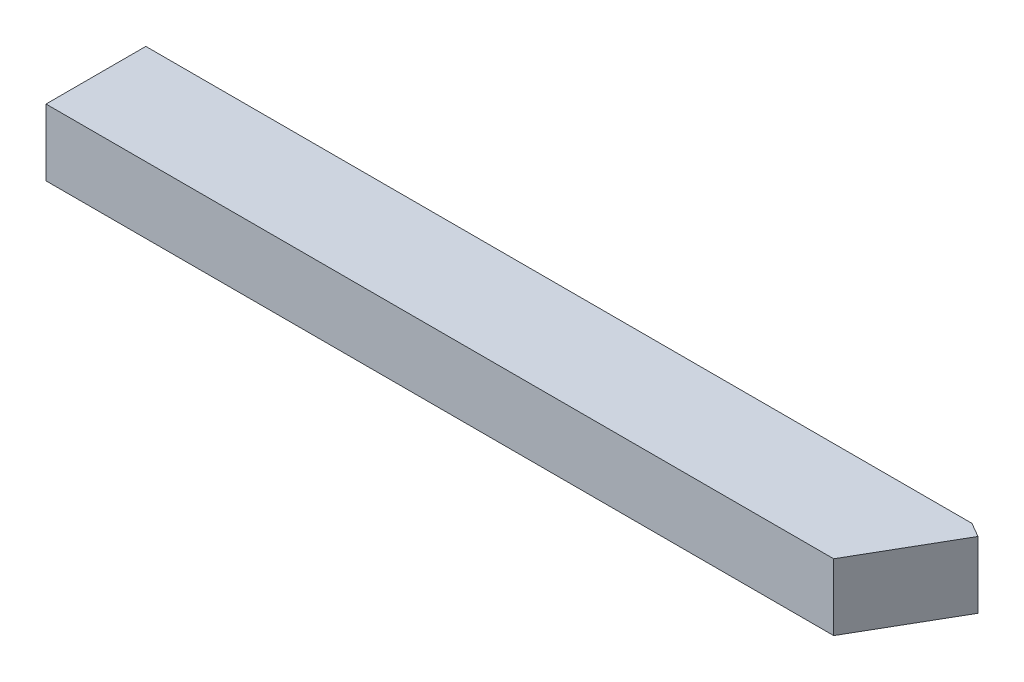
ISO-10303-21;
HEADER;
FILE_DESCRIPTION(('STEP AP214'),'2;1');
FILE_NAME('part.step','',(''),(''),'','','');
FILE_SCHEMA(('AUTOMOTIVE_DESIGN { 1 0 10303 214 1 1 1 1 }'));
ENDSEC;
DATA;
#1=APPLICATION_CONTEXT('core data for automotive mechanical design processes');
#2=APPLICATION_PROTOCOL_DEFINITION('international standard','automotive_design',2000,#1);
#3=PRODUCT_CONTEXT('',#1,'mechanical');
#4=PRODUCT('Part','Part','',(#3));
#5=PRODUCT_RELATED_PRODUCT_CATEGORY('part','',(#4));
#6=PRODUCT_DEFINITION_FORMATION('','',#4);
#7=PRODUCT_DEFINITION_CONTEXT('part definition',#1,'design');
#8=PRODUCT_DEFINITION('design','',#6,#7);
#9=PRODUCT_DEFINITION_SHAPE('','',#8);
#10=(LENGTH_UNIT() NAMED_UNIT(*) SI_UNIT(.MILLI.,.METRE.));
#11=(NAMED_UNIT(*) PLANE_ANGLE_UNIT() SI_UNIT($,.RADIAN.));
#12=(NAMED_UNIT(*) SI_UNIT($,.STERADIAN.) SOLID_ANGLE_UNIT());
#13=UNCERTAINTY_MEASURE_WITH_UNIT(LENGTH_MEASURE(1.E-05),#10,'distance_accuracy_value','');
#14=(GEOMETRIC_REPRESENTATION_CONTEXT(3) GLOBAL_UNCERTAINTY_ASSIGNED_CONTEXT((#13)) GLOBAL_UNIT_ASSIGNED_CONTEXT((#10,
#11,#12)) REPRESENTATION_CONTEXT('',''));
#15=CARTESIAN_POINT('',(0.,0.,0.));
#16=DIRECTION('',(0.,0.,1.));
#17=DIRECTION('',(1.,0.,0.));
#18=AXIS2_PLACEMENT_3D('',#15,#16,#17);
#19=CARTESIAN_POINT('',(307.975,12.7,-12.7));
#20=DIRECTION('',(0.,0.,1.));
#21=DIRECTION('',(0.,-1.,0.));
#22=AXIS2_PLACEMENT_3D('',#19,#20,#21);
#23=PLANE('',#22);
#24=DIRECTION('',(-1.,0.,0.));
#25=VECTOR('',#24,1.);
#26=CARTESIAN_POINT('',(307.975,12.7,-12.7));
#27=LINE('',#26,#25);
#28=CARTESIAN_POINT('',(315.307348418708,12.7,-12.7));
#29=VERTEX_POINT('',#28);
#30=CARTESIAN_POINT('',(0.,12.7,-12.7));
#31=VERTEX_POINT('',#30);
#32=EDGE_CURVE('E11',#29,#31,#27,.T.);
#33=ORIENTED_EDGE('',*,*,#32,.F.);
#34=DIRECTION('',(0.,1.,0.));
#35=VECTOR('',#34,1.);
#36=CARTESIAN_POINT('',(315.307348418708,-12.7,-12.7));
#37=LINE('',#36,#35);
#38=CARTESIAN_POINT('',(315.307348418708,-12.7,-12.7));
#39=VERTEX_POINT('',#38);
#40=EDGE_CURVE('E127',#39,#29,#37,.T.);
#41=ORIENTED_EDGE('',*,*,#40,.F.);
#42=DIRECTION('',(-1.,0.,0.));
#43=VECTOR('',#42,1.);
#44=CARTESIAN_POINT('',(307.975,-12.7,-12.7));
#45=LINE('',#44,#43);
#46=CARTESIAN_POINT('',(0.,-12.7,-12.7));
#47=VERTEX_POINT('',#46);
#48=EDGE_CURVE('E53',#39,#47,#45,.T.);
#49=ORIENTED_EDGE('',*,*,#48,.T.);
#50=DIRECTION('',(0.,1.,0.));
#51=VECTOR('',#50,1.);
#52=CARTESIAN_POINT('',(0.,12.7,-12.7));
#53=LINE('',#52,#51);
#54=EDGE_CURVE('E100',#47,#31,#53,.T.);
#55=ORIENTED_EDGE('',*,*,#54,.T.);
#56=EDGE_LOOP('',(#33,#41,#49,#55));
#57=FACE_BOUND('',#56,.T.);
#58=ADVANCED_FACE('F45',(#57),#23,.F.);
#59=CARTESIAN_POINT('',(307.975,12.7,12.7));
#60=DIRECTION('',(0.,-1.,0.));
#61=DIRECTION('',(0.,0.,-1.));
#62=AXIS2_PLACEMENT_3D('',#59,#60,#61);
#63=PLANE('',#62);
#64=DIRECTION('',(0.499999999999995,0.,-0.866025403784441));
#65=VECTOR('',#64,1.);
#66=CARTESIAN_POINT('',(307.975,12.7,12.7));
#67=LINE('',#66,#65);
#68=CARTESIAN_POINT('',(300.642651581292,12.7,25.4));
#69=VERTEX_POINT('',#68);
#70=CARTESIAN_POINT('',(320.806609732739,12.7,-9.525));
#71=VERTEX_POINT('',#70);
#72=EDGE_CURVE('E133',#69,#71,#67,.T.);
#73=ORIENTED_EDGE('',*,*,#72,.T.);
#74=DIRECTION('',(-0.866025403784438,0.,-0.500000000000001));
#75=VECTOR('',#74,1.);
#76=CARTESIAN_POINT('',(320.806609732739,12.7,-9.52499999999992));
#77=LINE('',#76,#75);
#78=EDGE_CURVE('E130',#71,#29,#77,.T.);
#79=ORIENTED_EDGE('',*,*,#78,.T.);
#80=ORIENTED_EDGE('',*,*,#32,.T.);
#81=DIRECTION('',(0.,0.,1.));
#82=VECTOR('',#81,1.);
#83=CARTESIAN_POINT('',(0.,12.7,12.7));
#84=LINE('',#83,#82);
#85=CARTESIAN_POINT('',(0.,12.7,25.4));
#86=VERTEX_POINT('',#85);
#87=EDGE_CURVE('E90',#31,#86,#84,.T.);
#88=ORIENTED_EDGE('',*,*,#87,.T.);
#89=DIRECTION('',(1.,0.,0.));
#90=VECTOR('',#89,1.);
#91=CARTESIAN_POINT('',(0.,12.7,25.4));
#92=LINE('',#91,#90);
#93=EDGE_CURVE('E95',#86,#69,#92,.T.);
#94=ORIENTED_EDGE('',*,*,#93,.T.);
#95=EDGE_LOOP('',(#73,#79,#80,#88,#94));
#96=FACE_BOUND('',#95,.T.);
#97=ADVANCED_FACE('F93',(#96),#63,.F.);
#98=CARTESIAN_POINT('',(307.975,-12.7,12.7));
#99=DIRECTION('',(0.,1.,0.));
#100=DIRECTION('',(0.,0.,1.));
#101=AXIS2_PLACEMENT_3D('',#98,#99,#100);
#102=PLANE('',#101);
#103=ORIENTED_EDGE('',*,*,#48,.F.);
#104=DIRECTION('',(0.866025403784438,0.,0.500000000000001));
#105=VECTOR('',#104,1.);
#106=CARTESIAN_POINT('',(320.806609732739,-12.7,-9.525));
#107=LINE('',#106,#105);
#108=CARTESIAN_POINT('',(320.806609732739,-12.7,-9.525));
#109=VERTEX_POINT('',#108);
#110=EDGE_CURVE('E123',#39,#109,#107,.T.);
#111=ORIENTED_EDGE('',*,*,#110,.T.);
#112=DIRECTION('',(-0.499999999999995,0.,0.866025403784441));
#113=VECTOR('',#112,1.);
#114=CARTESIAN_POINT('',(307.975,-12.7,12.7));
#115=LINE('',#114,#113);
#116=CARTESIAN_POINT('',(300.642651581292,-12.7,25.4));
#117=VERTEX_POINT('',#116);
#118=EDGE_CURVE('E140',#109,#117,#115,.T.);
#119=ORIENTED_EDGE('',*,*,#118,.T.);
#120=DIRECTION('',(-1.,0.,0.));
#121=VECTOR('',#120,1.);
#122=CARTESIAN_POINT('',(0.,-12.7,25.4));
#123=LINE('',#122,#121);
#124=CARTESIAN_POINT('',(0.,-12.7,25.4));
#125=VERTEX_POINT('',#124);
#126=EDGE_CURVE('E120',#117,#125,#123,.T.);
#127=ORIENTED_EDGE('',*,*,#126,.T.);
#128=DIRECTION('',(0.,0.,-1.));
#129=VECTOR('',#128,1.);
#130=CARTESIAN_POINT('',(0.,-12.7,12.7));
#131=LINE('',#130,#129);
#132=EDGE_CURVE('E99',#125,#47,#131,.T.);
#133=ORIENTED_EDGE('',*,*,#132,.T.);
#134=EDGE_LOOP('',(#103,#111,#119,#127,#133));
#135=FACE_BOUND('',#134,.T.);
#136=ADVANCED_FACE('F177',(#135),#102,.F.);
#137=CARTESIAN_POINT('',(0.,0.,0.));
#138=DIRECTION('',(1.,0.,0.));
#139=DIRECTION('',(0.,0.,-1.));
#140=AXIS2_PLACEMENT_3D('',#137,#138,#139);
#141=PLANE('',#140);
#142=ORIENTED_EDGE('',*,*,#54,.F.);
#143=ORIENTED_EDGE('',*,*,#132,.F.);
#144=DIRECTION('',(0.,1.,0.));
#145=VECTOR('',#144,1.);
#146=CARTESIAN_POINT('',(0.,-320.936744443293,25.4));
#147=LINE('',#146,#145);
#148=EDGE_CURVE('E103',#125,#86,#147,.T.);
#149=ORIENTED_EDGE('',*,*,#148,.T.);
#150=ORIENTED_EDGE('',*,*,#87,.F.);
#151=EDGE_LOOP('',(#142,#143,#149,#150));
#152=FACE_BOUND('',#151,.T.);
#153=ADVANCED_FACE('F104',(#152),#141,.F.);
#154=CARTESIAN_POINT('',(307.975,-41.1571644464681,12.7));
#155=DIRECTION('',(0.866025403784441,0.,0.499999999999995));
#156=DIRECTION('',(0.499999999999995,0.,-0.866025403784441));
#157=AXIS2_PLACEMENT_3D('',#154,#155,#156);
#158=PLANE('',#157);
#159=ORIENTED_EDGE('',*,*,#118,.F.);
#160=DIRECTION('',(0.,1.,0.));
#161=VECTOR('',#160,1.);
#162=CARTESIAN_POINT('',(320.806609732739,-41.1571644464681,-9.525));
#163=LINE('',#162,#161);
#164=EDGE_CURVE('E136',#109,#71,#163,.T.);
#165=ORIENTED_EDGE('',*,*,#164,.T.);
#166=ORIENTED_EDGE('',*,*,#72,.F.);
#167=DIRECTION('',(0.,1.,0.));
#168=VECTOR('',#167,1.);
#169=CARTESIAN_POINT('',(300.642651581292,-320.936744443293,25.4));
#170=LINE('',#169,#168);
#171=EDGE_CURVE('E109',#117,#69,#170,.T.);
#172=ORIENTED_EDGE('',*,*,#171,.F.);
#173=EDGE_LOOP('',(#159,#165,#166,#172));
#174=FACE_BOUND('',#173,.T.);
#175=ADVANCED_FACE('F180',(#174),#158,.T.);
#176=CARTESIAN_POINT('',(320.806609732739,-12.7,-9.525));
#177=DIRECTION('',(-0.500000000000001,0.,0.866025403784438));
#178=DIRECTION('',(0.866025403784438,0.,0.500000000000001));
#179=AXIS2_PLACEMENT_3D('',#176,#177,#178);
#180=PLANE('',#179);
#181=ORIENTED_EDGE('',*,*,#164,.F.);
#182=ORIENTED_EDGE('',*,*,#110,.F.);
#183=ORIENTED_EDGE('',*,*,#40,.T.);
#184=ORIENTED_EDGE('',*,*,#78,.F.);
#185=EDGE_LOOP('',(#181,#182,#183,#184));
#186=FACE_BOUND('',#185,.T.);
#187=ADVANCED_FACE('F182',(#186),#180,.F.);
#188=CARTESIAN_POINT('',(0.,-320.936744443293,25.4));
#189=DIRECTION('',(0.,0.,1.));
#190=DIRECTION('',(1.,0.,0.));
#191=AXIS2_PLACEMENT_3D('',#188,#189,#190);
#192=PLANE('',#191);
#193=ORIENTED_EDGE('',*,*,#126,.F.);
#194=ORIENTED_EDGE('',*,*,#171,.T.);
#195=ORIENTED_EDGE('',*,*,#93,.F.);
#196=ORIENTED_EDGE('',*,*,#148,.F.);
#197=EDGE_LOOP('',(#193,#194,#195,#196));
#198=FACE_BOUND('',#197,.T.);
#199=ADVANCED_FACE('F112',(#198),#192,.T.);
#200=CLOSED_SHELL('',(#58,#97,#136,#153,#175,#187,#199));
#201=MANIFOLD_SOLID_BREP('B2',#200);
#202=ADVANCED_BREP_SHAPE_REPRESENTATION('',(#18,#201),#14);
#203=SHAPE_DEFINITION_REPRESENTATION(#9,#202);
ENDSEC;
END-ISO-10303-21;
